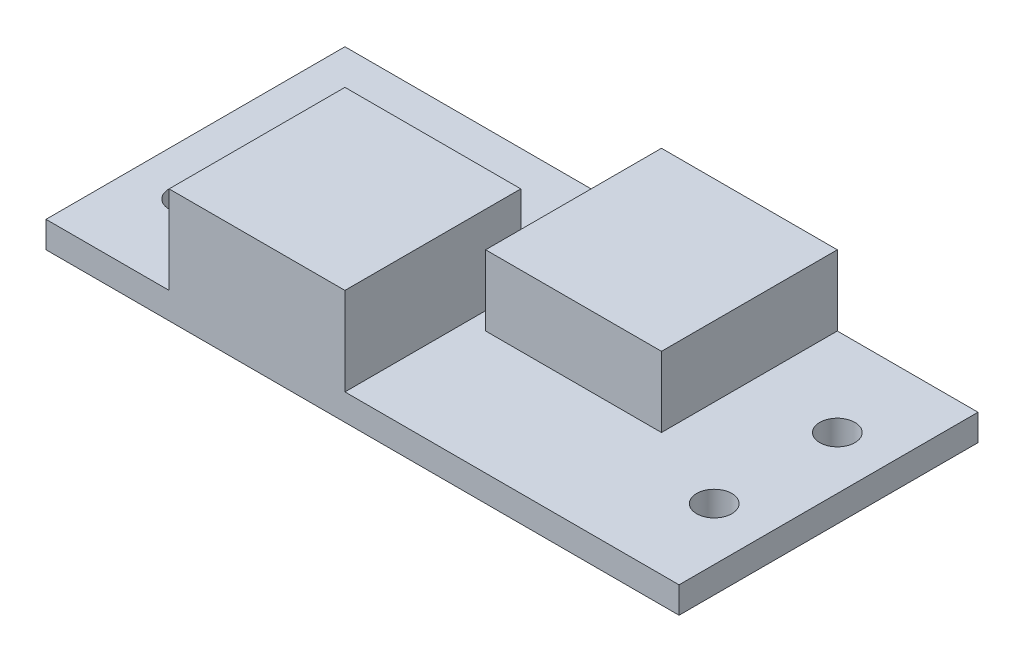
ISO-10303-21;
HEADER;
FILE_DESCRIPTION(('STEP AP214'),'2;1');
FILE_NAME('part.step','',(''),(''),'','','');
FILE_SCHEMA(('AUTOMOTIVE_DESIGN { 1 0 10303 214 1 1 1 1 }'));
ENDSEC;
DATA;
#1=APPLICATION_CONTEXT('core data for automotive mechanical design processes');
#2=APPLICATION_PROTOCOL_DEFINITION('international standard','automotive_design',2000,#1);
#3=PRODUCT_CONTEXT('',#1,'mechanical');
#4=PRODUCT('Part','Part','',(#3));
#5=PRODUCT_RELATED_PRODUCT_CATEGORY('part','',(#4));
#6=PRODUCT_DEFINITION_FORMATION('','',#4);
#7=PRODUCT_DEFINITION_CONTEXT('part definition',#1,'design');
#8=PRODUCT_DEFINITION('design','',#6,#7);
#9=PRODUCT_DEFINITION_SHAPE('','',#8);
#10=(LENGTH_UNIT() NAMED_UNIT(*) SI_UNIT(.MILLI.,.METRE.));
#11=(NAMED_UNIT(*) PLANE_ANGLE_UNIT() SI_UNIT($,.RADIAN.));
#12=(NAMED_UNIT(*) SI_UNIT($,.STERADIAN.) SOLID_ANGLE_UNIT());
#13=UNCERTAINTY_MEASURE_WITH_UNIT(LENGTH_MEASURE(1.E-05),#10,'distance_accuracy_value','');
#14=(GEOMETRIC_REPRESENTATION_CONTEXT(3) GLOBAL_UNCERTAINTY_ASSIGNED_CONTEXT((#13)) GLOBAL_UNIT_ASSIGNED_CONTEXT((#10,
#11,#12)) REPRESENTATION_CONTEXT('',''));
#15=CARTESIAN_POINT('',(0.,0.,0.));
#16=DIRECTION('',(0.,0.,1.));
#17=DIRECTION('',(1.,0.,0.));
#18=AXIS2_PLACEMENT_3D('',#15,#16,#17);
#19=CARTESIAN_POINT('',(0.,1.5,0.));
#20=DIRECTION('',(0.,1.,0.));
#21=DIRECTION('',(0.,0.,1.));
#22=AXIS2_PLACEMENT_3D('',#19,#20,#21);
#23=PLANE('',#22);
#24=CARTESIAN_POINT('',(33.,1.5,5.));
#25=DIRECTION('',(0.,1.,0.));
#26=DIRECTION('',(0.,0.,1.));
#27=AXIS2_PLACEMENT_3D('',#24,#25,#26);
#28=CIRCLE('',#27,1.);
#29=CARTESIAN_POINT('',(33.,1.5,6.));
#30=VERTEX_POINT('',#29);
#31=EDGE_CURVE('E253',#30,#30,#28,.T.);
#32=ORIENTED_EDGE('',*,*,#31,.F.);
#33=EDGE_LOOP('',(#32));
#34=FACE_BOUND('',#33,.T.);
#35=CARTESIAN_POINT('',(33.,1.5,12.));
#36=DIRECTION('',(0.,1.,0.));
#37=DIRECTION('',(0.,0.,1.));
#38=AXIS2_PLACEMENT_3D('',#35,#36,#37);
#39=CIRCLE('',#38,1.);
#40=CARTESIAN_POINT('',(33.,1.5,13.));
#41=VERTEX_POINT('',#40);
#42=EDGE_CURVE('E260',#41,#41,#39,.T.);
#43=ORIENTED_EDGE('',*,*,#42,.F.);
#44=EDGE_LOOP('',(#43));
#45=FACE_BOUND('',#44,.T.);
#46=CARTESIAN_POINT('',(3.,1.5,12.));
#47=DIRECTION('',(0.,1.,0.));
#48=DIRECTION('',(0.,0.,1.));
#49=AXIS2_PLACEMENT_3D('',#46,#47,#48);
#50=CIRCLE('',#49,1.);
#51=CARTESIAN_POINT('',(3.,1.5,13.));
#52=VERTEX_POINT('',#51);
#53=EDGE_CURVE('E249',#52,#52,#50,.T.);
#54=ORIENTED_EDGE('',*,*,#53,.F.);
#55=EDGE_LOOP('',(#54));
#56=FACE_BOUND('',#55,.T.);
#57=CARTESIAN_POINT('',(3.,1.5,5.));
#58=DIRECTION('',(0.,1.,0.));
#59=DIRECTION('',(0.,0.,1.));
#60=AXIS2_PLACEMENT_3D('',#57,#58,#59);
#61=CIRCLE('',#60,1.);
#62=CARTESIAN_POINT('',(3.,1.5,6.));
#63=VERTEX_POINT('',#62);
#64=EDGE_CURVE('E245',#63,#63,#61,.T.);
#65=ORIENTED_EDGE('',*,*,#64,.F.);
#66=EDGE_LOOP('',(#65));
#67=FACE_BOUND('',#66,.T.);
#68=DIRECTION('',(1.,0.,0.));
#69=VECTOR('',#68,1.);
#70=CARTESIAN_POINT('',(0.,1.5,17.));
#71=LINE('',#70,#69);
#72=CARTESIAN_POINT('',(0.,1.5,17.));
#73=VERTEX_POINT('',#72);
#74=CARTESIAN_POINT('',(7.,1.5,17.));
#75=VERTEX_POINT('',#74);
#76=EDGE_CURVE('E209',#73,#75,#71,.T.);
#77=ORIENTED_EDGE('',*,*,#76,.T.);
#78=DIRECTION('',(0.,0.,1.));
#79=VECTOR('',#78,1.);
#80=CARTESIAN_POINT('',(7.,1.5,17.));
#81=LINE('',#80,#79);
#82=CARTESIAN_POINT('',(7.,1.5,7.));
#83=VERTEX_POINT('',#82);
#84=EDGE_CURVE('E156',#83,#75,#81,.T.);
#85=ORIENTED_EDGE('',*,*,#84,.F.);
#86=DIRECTION('',(-1.,0.,0.));
#87=VECTOR('',#86,1.);
#88=CARTESIAN_POINT('',(7.,1.5,7.));
#89=LINE('',#88,#87);
#90=CARTESIAN_POINT('',(17.,1.5,7.));
#91=VERTEX_POINT('',#90);
#92=EDGE_CURVE('E152',#91,#83,#89,.T.);
#93=ORIENTED_EDGE('',*,*,#92,.F.);
#94=DIRECTION('',(0.,0.,-1.));
#95=VECTOR('',#94,1.);
#96=CARTESIAN_POINT('',(17.,1.5,17.));
#97=LINE('',#96,#95);
#98=CARTESIAN_POINT('',(17.,1.5,17.));
#99=VERTEX_POINT('',#98);
#100=EDGE_CURVE('E281',#99,#91,#97,.T.);
#101=ORIENTED_EDGE('',*,*,#100,.F.);
#102=CARTESIAN_POINT('',(36.,1.5,17.));
#103=VERTEX_POINT('',#102);
#104=EDGE_CURVE('E207',#99,#103,#71,.T.);
#105=ORIENTED_EDGE('',*,*,#104,.T.);
#106=DIRECTION('',(0.,0.,-1.));
#107=VECTOR('',#106,1.);
#108=CARTESIAN_POINT('',(36.,1.5,0.));
#109=LINE('',#108,#107);
#110=CARTESIAN_POINT('',(36.,1.5,0.));
#111=VERTEX_POINT('',#110);
#112=EDGE_CURVE('E212',#103,#111,#109,.T.);
#113=ORIENTED_EDGE('',*,*,#112,.T.);
#114=DIRECTION('',(-1.,0.,0.));
#115=VECTOR('',#114,1.);
#116=CARTESIAN_POINT('',(0.,1.5,0.));
#117=LINE('',#116,#115);
#118=CARTESIAN_POINT('',(28.,1.5,0.));
#119=VERTEX_POINT('',#118);
#120=EDGE_CURVE('E216',#111,#119,#117,.T.);
#121=ORIENTED_EDGE('',*,*,#120,.T.);
#122=DIRECTION('',(0.,0.,-1.));
#123=VECTOR('',#122,1.);
#124=CARTESIAN_POINT('',(28.,1.5,0.));
#125=LINE('',#124,#123);
#126=CARTESIAN_POINT('',(28.,1.5,10.));
#127=VERTEX_POINT('',#126);
#128=EDGE_CURVE('E65',#127,#119,#125,.T.);
#129=ORIENTED_EDGE('',*,*,#128,.F.);
#130=DIRECTION('',(1.,0.,0.));
#131=VECTOR('',#130,1.);
#132=CARTESIAN_POINT('',(28.,1.5,10.));
#133=LINE('',#132,#131);
#134=CARTESIAN_POINT('',(18.,1.5,10.));
#135=VERTEX_POINT('',#134);
#136=EDGE_CURVE('E172',#135,#127,#133,.T.);
#137=ORIENTED_EDGE('',*,*,#136,.F.);
#138=DIRECTION('',(0.,0.,1.));
#139=VECTOR('',#138,1.);
#140=CARTESIAN_POINT('',(18.,1.5,0.));
#141=LINE('',#140,#139);
#142=CARTESIAN_POINT('',(18.,1.5,0.));
#143=VERTEX_POINT('',#142);
#144=EDGE_CURVE('E162',#143,#135,#141,.T.);
#145=ORIENTED_EDGE('',*,*,#144,.F.);
#146=CARTESIAN_POINT('',(0.,1.5,0.));
#147=VERTEX_POINT('',#146);
#148=EDGE_CURVE('E215',#143,#147,#117,.T.);
#149=ORIENTED_EDGE('',*,*,#148,.T.);
#150=DIRECTION('',(0.,0.,1.));
#151=VECTOR('',#150,1.);
#152=CARTESIAN_POINT('',(0.,1.5,0.));
#153=LINE('',#152,#151);
#154=EDGE_CURVE('E203',#147,#73,#153,.T.);
#155=ORIENTED_EDGE('',*,*,#154,.T.);
#156=EDGE_LOOP('',(#77,#85,#93,#101,#105,#113,#121,#129,#137,#145,#149,#155));
#157=FACE_BOUND('',#156,.T.);
#158=ADVANCED_FACE('F39',(#34,#45,#56,#67,#157),#23,.T.);
#159=CARTESIAN_POINT('',(0.,1.5,0.));
#160=DIRECTION('',(1.,0.,0.));
#161=DIRECTION('',(0.,0.,-1.));
#162=AXIS2_PLACEMENT_3D('',#159,#160,#161);
#163=PLANE('',#162);
#164=DIRECTION('',(0.,0.,1.));
#165=VECTOR('',#164,1.);
#166=CARTESIAN_POINT('',(0.,0.,0.));
#167=LINE('',#166,#165);
#168=CARTESIAN_POINT('',(0.,0.,0.));
#169=VERTEX_POINT('',#168);
#170=CARTESIAN_POINT('',(0.,0.,17.));
#171=VERTEX_POINT('',#170);
#172=EDGE_CURVE('E202',#169,#171,#167,.T.);
#173=ORIENTED_EDGE('',*,*,#172,.T.);
#174=DIRECTION('',(0.,-1.,0.));
#175=VECTOR('',#174,1.);
#176=CARTESIAN_POINT('',(0.,1.5,17.));
#177=LINE('',#176,#175);
#178=EDGE_CURVE('E11',#73,#171,#177,.T.);
#179=ORIENTED_EDGE('',*,*,#178,.F.);
#180=ORIENTED_EDGE('',*,*,#154,.F.);
#181=DIRECTION('',(0.,-1.,0.));
#182=VECTOR('',#181,1.);
#183=CARTESIAN_POINT('',(0.,1.5,0.));
#184=LINE('',#183,#182);
#185=EDGE_CURVE('E219',#147,#169,#184,.T.);
#186=ORIENTED_EDGE('',*,*,#185,.T.);
#187=EDGE_LOOP('',(#173,#179,#180,#186));
#188=FACE_BOUND('',#187,.T.);
#189=ADVANCED_FACE('F41',(#188),#163,.F.);
#190=CARTESIAN_POINT('',(0.,1.5,17.));
#191=DIRECTION('',(0.,0.,-1.));
#192=DIRECTION('',(-1.,0.,0.));
#193=AXIS2_PLACEMENT_3D('',#190,#191,#192);
#194=PLANE('',#193);
#195=DIRECTION('',(1.,0.,0.));
#196=VECTOR('',#195,1.);
#197=CARTESIAN_POINT('',(0.,0.,17.));
#198=LINE('',#197,#196);
#199=CARTESIAN_POINT('',(36.,0.,17.));
#200=VERTEX_POINT('',#199);
#201=EDGE_CURVE('E223',#171,#200,#198,.T.);
#202=ORIENTED_EDGE('',*,*,#201,.T.);
#203=DIRECTION('',(0.,-1.,0.));
#204=VECTOR('',#203,1.);
#205=CARTESIAN_POINT('',(36.,1.5,17.));
#206=LINE('',#205,#204);
#207=EDGE_CURVE('E49',#103,#200,#206,.T.);
#208=ORIENTED_EDGE('',*,*,#207,.F.);
#209=ORIENTED_EDGE('',*,*,#104,.F.);
#210=DIRECTION('',(0.,-1.,0.));
#211=VECTOR('',#210,1.);
#212=CARTESIAN_POINT('',(17.,6.5,17.));
#213=LINE('',#212,#211);
#214=CARTESIAN_POINT('',(17.,6.5,17.));
#215=VERTEX_POINT('',#214);
#216=EDGE_CURVE('E138',#215,#99,#213,.T.);
#217=ORIENTED_EDGE('',*,*,#216,.F.);
#218=DIRECTION('',(1.,0.,0.));
#219=VECTOR('',#218,1.);
#220=CARTESIAN_POINT('',(7.,6.5,17.));
#221=LINE('',#220,#219);
#222=CARTESIAN_POINT('',(7.,6.5,17.));
#223=VERTEX_POINT('',#222);
#224=EDGE_CURVE('E131',#223,#215,#221,.T.);
#225=ORIENTED_EDGE('',*,*,#224,.F.);
#226=DIRECTION('',(0.,-1.,0.));
#227=VECTOR('',#226,1.);
#228=CARTESIAN_POINT('',(7.,6.5,17.));
#229=LINE('',#228,#227);
#230=EDGE_CURVE('E135',#223,#75,#229,.T.);
#231=ORIENTED_EDGE('',*,*,#230,.T.);
#232=ORIENTED_EDGE('',*,*,#76,.F.);
#233=ORIENTED_EDGE('',*,*,#178,.T.);
#234=EDGE_LOOP('',(#202,#208,#209,#217,#225,#231,#232,#233));
#235=FACE_BOUND('',#234,.T.);
#236=ADVANCED_FACE('F133',(#235),#194,.F.);
#237=CARTESIAN_POINT('',(36.,1.5,0.));
#238=DIRECTION('',(-1.,0.,0.));
#239=DIRECTION('',(0.,0.,1.));
#240=AXIS2_PLACEMENT_3D('',#237,#238,#239);
#241=PLANE('',#240);
#242=DIRECTION('',(0.,0.,-1.));
#243=VECTOR('',#242,1.);
#244=CARTESIAN_POINT('',(36.,0.,0.));
#245=LINE('',#244,#243);
#246=CARTESIAN_POINT('',(36.,0.,0.));
#247=VERTEX_POINT('',#246);
#248=EDGE_CURVE('E226',#200,#247,#245,.T.);
#249=ORIENTED_EDGE('',*,*,#248,.T.);
#250=DIRECTION('',(0.,-1.,0.));
#251=VECTOR('',#250,1.);
#252=CARTESIAN_POINT('',(36.,1.5,0.));
#253=LINE('',#252,#251);
#254=EDGE_CURVE('E234',#111,#247,#253,.T.);
#255=ORIENTED_EDGE('',*,*,#254,.F.);
#256=ORIENTED_EDGE('',*,*,#112,.F.);
#257=ORIENTED_EDGE('',*,*,#207,.T.);
#258=EDGE_LOOP('',(#249,#255,#256,#257));
#259=FACE_BOUND('',#258,.T.);
#260=ADVANCED_FACE('F302',(#259),#241,.F.);
#261=CARTESIAN_POINT('',(0.,1.5,0.));
#262=DIRECTION('',(0.,0.,1.));
#263=DIRECTION('',(1.,0.,0.));
#264=AXIS2_PLACEMENT_3D('',#261,#262,#263);
#265=PLANE('',#264);
#266=DIRECTION('',(-1.,0.,0.));
#267=VECTOR('',#266,1.);
#268=CARTESIAN_POINT('',(0.,0.,0.));
#269=LINE('',#268,#267);
#270=EDGE_CURVE('E208',#247,#169,#269,.T.);
#271=ORIENTED_EDGE('',*,*,#270,.T.);
#272=ORIENTED_EDGE('',*,*,#185,.F.);
#273=ORIENTED_EDGE('',*,*,#148,.F.);
#274=DIRECTION('',(0.,-1.,0.));
#275=VECTOR('',#274,1.);
#276=CARTESIAN_POINT('',(18.,5.5,0.));
#277=LINE('',#276,#275);
#278=CARTESIAN_POINT('',(18.,5.5,0.));
#279=VERTEX_POINT('',#278);
#280=EDGE_CURVE('E194',#279,#143,#277,.T.);
#281=ORIENTED_EDGE('',*,*,#280,.F.);
#282=DIRECTION('',(-1.,0.,0.));
#283=VECTOR('',#282,1.);
#284=CARTESIAN_POINT('',(28.,5.5,0.));
#285=LINE('',#284,#283);
#286=CARTESIAN_POINT('',(28.,5.5,0.));
#287=VERTEX_POINT('',#286);
#288=EDGE_CURVE('E171',#287,#279,#285,.T.);
#289=ORIENTED_EDGE('',*,*,#288,.F.);
#290=DIRECTION('',(0.,-1.,0.));
#291=VECTOR('',#290,1.);
#292=CARTESIAN_POINT('',(28.,5.5,0.));
#293=LINE('',#292,#291);
#294=EDGE_CURVE('E198',#287,#119,#293,.T.);
#295=ORIENTED_EDGE('',*,*,#294,.T.);
#296=ORIENTED_EDGE('',*,*,#120,.F.);
#297=ORIENTED_EDGE('',*,*,#254,.T.);
#298=EDGE_LOOP('',(#271,#272,#273,#281,#289,#295,#296,#297));
#299=FACE_BOUND('',#298,.T.);
#300=ADVANCED_FACE('F306',(#299),#265,.F.);
#301=CARTESIAN_POINT('',(0.,0.,0.));
#302=DIRECTION('',(0.,1.,0.));
#303=DIRECTION('',(0.,0.,1.));
#304=AXIS2_PLACEMENT_3D('',#301,#302,#303);
#305=PLANE('',#304);
#306=CARTESIAN_POINT('',(33.,0.,5.));
#307=DIRECTION('',(0.,1.,0.));
#308=DIRECTION('',(0.,0.,1.));
#309=AXIS2_PLACEMENT_3D('',#306,#307,#308);
#310=CIRCLE('',#309,1.);
#311=CARTESIAN_POINT('',(33.,0.,6.));
#312=VERTEX_POINT('',#311);
#313=EDGE_CURVE('E43',#312,#312,#310,.T.);
#314=ORIENTED_EDGE('',*,*,#313,.T.);
#315=EDGE_LOOP('',(#314));
#316=FACE_BOUND('',#315,.T.);
#317=CARTESIAN_POINT('',(33.,0.,12.));
#318=DIRECTION('',(0.,1.,0.));
#319=DIRECTION('',(0.,0.,1.));
#320=AXIS2_PLACEMENT_3D('',#317,#318,#319);
#321=CIRCLE('',#320,1.);
#322=CARTESIAN_POINT('',(33.,0.,13.));
#323=VERTEX_POINT('',#322);
#324=EDGE_CURVE('E250',#323,#323,#321,.T.);
#325=ORIENTED_EDGE('',*,*,#324,.T.);
#326=EDGE_LOOP('',(#325));
#327=FACE_BOUND('',#326,.T.);
#328=CARTESIAN_POINT('',(3.,0.,12.));
#329=DIRECTION('',(0.,1.,0.));
#330=DIRECTION('',(0.,0.,1.));
#331=AXIS2_PLACEMENT_3D('',#328,#329,#330);
#332=CIRCLE('',#331,1.);
#333=CARTESIAN_POINT('',(3.,0.,13.));
#334=VERTEX_POINT('',#333);
#335=EDGE_CURVE('E246',#334,#334,#332,.T.);
#336=ORIENTED_EDGE('',*,*,#335,.T.);
#337=EDGE_LOOP('',(#336));
#338=FACE_BOUND('',#337,.T.);
#339=CARTESIAN_POINT('',(3.,0.,5.));
#340=DIRECTION('',(0.,1.,0.));
#341=DIRECTION('',(0.,0.,1.));
#342=AXIS2_PLACEMENT_3D('',#339,#340,#341);
#343=CIRCLE('',#342,1.);
#344=CARTESIAN_POINT('',(3.,0.,6.));
#345=VERTEX_POINT('',#344);
#346=EDGE_CURVE('E241',#345,#345,#343,.T.);
#347=ORIENTED_EDGE('',*,*,#346,.T.);
#348=EDGE_LOOP('',(#347));
#349=FACE_BOUND('',#348,.T.);
#350=ORIENTED_EDGE('',*,*,#172,.F.);
#351=ORIENTED_EDGE('',*,*,#270,.F.);
#352=ORIENTED_EDGE('',*,*,#248,.F.);
#353=ORIENTED_EDGE('',*,*,#201,.F.);
#354=EDGE_LOOP('',(#350,#351,#352,#353));
#355=FACE_BOUND('',#354,.T.);
#356=ADVANCED_FACE('F298',(#316,#327,#338,#349,#355),#305,.F.);
#357=CARTESIAN_POINT('',(28.,5.5,0.));
#358=DIRECTION('',(-1.,0.,0.));
#359=DIRECTION('',(0.,0.,1.));
#360=AXIS2_PLACEMENT_3D('',#357,#358,#359);
#361=PLANE('',#360);
#362=ORIENTED_EDGE('',*,*,#128,.T.);
#363=ORIENTED_EDGE('',*,*,#294,.F.);
#364=DIRECTION('',(0.,0.,-1.));
#365=VECTOR('',#364,1.);
#366=CARTESIAN_POINT('',(28.,5.5,0.));
#367=LINE('',#366,#365);
#368=CARTESIAN_POINT('',(28.,5.5,10.));
#369=VERTEX_POINT('',#368);
#370=EDGE_CURVE('E167',#369,#287,#367,.T.);
#371=ORIENTED_EDGE('',*,*,#370,.F.);
#372=DIRECTION('',(0.,-1.,0.));
#373=VECTOR('',#372,1.);
#374=CARTESIAN_POINT('',(28.,5.5,10.));
#375=LINE('',#374,#373);
#376=EDGE_CURVE('E180',#369,#127,#375,.T.);
#377=ORIENTED_EDGE('',*,*,#376,.T.);
#378=EDGE_LOOP('',(#362,#363,#371,#377));
#379=FACE_BOUND('',#378,.T.);
#380=ADVANCED_FACE('F322',(#379),#361,.F.);
#381=CARTESIAN_POINT('',(18.,5.5,0.));
#382=DIRECTION('',(1.,0.,0.));
#383=DIRECTION('',(0.,0.,-1.));
#384=AXIS2_PLACEMENT_3D('',#381,#382,#383);
#385=PLANE('',#384);
#386=ORIENTED_EDGE('',*,*,#144,.T.);
#387=DIRECTION('',(0.,-1.,0.));
#388=VECTOR('',#387,1.);
#389=CARTESIAN_POINT('',(18.,5.5,10.));
#390=LINE('',#389,#388);
#391=CARTESIAN_POINT('',(18.,5.5,10.));
#392=VERTEX_POINT('',#391);
#393=EDGE_CURVE('E190',#392,#135,#390,.T.);
#394=ORIENTED_EDGE('',*,*,#393,.F.);
#395=DIRECTION('',(0.,0.,1.));
#396=VECTOR('',#395,1.);
#397=CARTESIAN_POINT('',(18.,5.5,0.));
#398=LINE('',#397,#396);
#399=EDGE_CURVE('E175',#279,#392,#398,.T.);
#400=ORIENTED_EDGE('',*,*,#399,.F.);
#401=ORIENTED_EDGE('',*,*,#280,.T.);
#402=EDGE_LOOP('',(#386,#394,#400,#401));
#403=FACE_BOUND('',#402,.T.);
#404=ADVANCED_FACE('F314',(#403),#385,.F.);
#405=CARTESIAN_POINT('',(28.,5.5,10.));
#406=DIRECTION('',(0.,0.,-1.));
#407=DIRECTION('',(-1.,0.,0.));
#408=AXIS2_PLACEMENT_3D('',#405,#406,#407);
#409=PLANE('',#408);
#410=ORIENTED_EDGE('',*,*,#136,.T.);
#411=ORIENTED_EDGE('',*,*,#376,.F.);
#412=DIRECTION('',(1.,0.,0.));
#413=VECTOR('',#412,1.);
#414=CARTESIAN_POINT('',(28.,5.5,10.));
#415=LINE('',#414,#413);
#416=EDGE_CURVE('E178',#392,#369,#415,.T.);
#417=ORIENTED_EDGE('',*,*,#416,.F.);
#418=ORIENTED_EDGE('',*,*,#393,.T.);
#419=EDGE_LOOP('',(#410,#411,#417,#418));
#420=FACE_BOUND('',#419,.T.);
#421=ADVANCED_FACE('F324',(#420),#409,.F.);
#422=CARTESIAN_POINT('',(0.,5.5,0.));
#423=DIRECTION('',(0.,-1.,0.));
#424=DIRECTION('',(0.,0.,-1.));
#425=AXIS2_PLACEMENT_3D('',#422,#423,#424);
#426=PLANE('',#425);
#427=ORIENTED_EDGE('',*,*,#370,.T.);
#428=ORIENTED_EDGE('',*,*,#288,.T.);
#429=ORIENTED_EDGE('',*,*,#399,.T.);
#430=ORIENTED_EDGE('',*,*,#416,.T.);
#431=EDGE_LOOP('',(#427,#428,#429,#430));
#432=FACE_BOUND('',#431,.T.);
#433=ADVANCED_FACE('F318',(#432),#426,.F.);
#434=CARTESIAN_POINT('',(7.,6.5,17.));
#435=DIRECTION('',(1.,0.,0.));
#436=DIRECTION('',(0.,0.,-1.));
#437=AXIS2_PLACEMENT_3D('',#434,#435,#436);
#438=PLANE('',#437);
#439=ORIENTED_EDGE('',*,*,#84,.T.);
#440=ORIENTED_EDGE('',*,*,#230,.F.);
#441=DIRECTION('',(0.,0.,1.));
#442=VECTOR('',#441,1.);
#443=CARTESIAN_POINT('',(7.,6.5,17.));
#444=LINE('',#443,#442);
#445=CARTESIAN_POINT('',(7.,6.5,7.));
#446=VERTEX_POINT('',#445);
#447=EDGE_CURVE('E143',#446,#223,#444,.T.);
#448=ORIENTED_EDGE('',*,*,#447,.F.);
#449=DIRECTION('',(0.,-1.,0.));
#450=VECTOR('',#449,1.);
#451=CARTESIAN_POINT('',(7.,6.5,7.));
#452=LINE('',#451,#450);
#453=EDGE_CURVE('E278',#446,#83,#452,.T.);
#454=ORIENTED_EDGE('',*,*,#453,.T.);
#455=EDGE_LOOP('',(#439,#440,#448,#454));
#456=FACE_BOUND('',#455,.T.);
#457=ADVANCED_FACE('F154',(#456),#438,.F.);
#458=CARTESIAN_POINT('',(17.,6.5,17.));
#459=DIRECTION('',(-1.,0.,0.));
#460=DIRECTION('',(0.,0.,1.));
#461=AXIS2_PLACEMENT_3D('',#458,#459,#460);
#462=PLANE('',#461);
#463=ORIENTED_EDGE('',*,*,#100,.T.);
#464=DIRECTION('',(0.,-1.,0.));
#465=VECTOR('',#464,1.);
#466=CARTESIAN_POINT('',(17.,6.5,7.));
#467=LINE('',#466,#465);
#468=CARTESIAN_POINT('',(17.,6.5,7.));
#469=VERTEX_POINT('',#468);
#470=EDGE_CURVE('E57',#469,#91,#467,.T.);
#471=ORIENTED_EDGE('',*,*,#470,.F.);
#472=DIRECTION('',(0.,0.,-1.));
#473=VECTOR('',#472,1.);
#474=CARTESIAN_POINT('',(17.,6.5,17.));
#475=LINE('',#474,#473);
#476=EDGE_CURVE('E142',#215,#469,#475,.T.);
#477=ORIENTED_EDGE('',*,*,#476,.F.);
#478=ORIENTED_EDGE('',*,*,#216,.T.);
#479=EDGE_LOOP('',(#463,#471,#477,#478));
#480=FACE_BOUND('',#479,.T.);
#481=ADVANCED_FACE('F394',(#480),#462,.F.);
#482=CARTESIAN_POINT('',(7.,6.5,7.));
#483=DIRECTION('',(0.,0.,1.));
#484=DIRECTION('',(1.,0.,0.));
#485=AXIS2_PLACEMENT_3D('',#482,#483,#484);
#486=PLANE('',#485);
#487=ORIENTED_EDGE('',*,*,#92,.T.);
#488=ORIENTED_EDGE('',*,*,#453,.F.);
#489=DIRECTION('',(-1.,0.,0.));
#490=VECTOR('',#489,1.);
#491=CARTESIAN_POINT('',(7.,6.5,7.));
#492=LINE('',#491,#490);
#493=EDGE_CURVE('E147',#469,#446,#492,.T.);
#494=ORIENTED_EDGE('',*,*,#493,.F.);
#495=ORIENTED_EDGE('',*,*,#470,.T.);
#496=EDGE_LOOP('',(#487,#488,#494,#495));
#497=FACE_BOUND('',#496,.T.);
#498=ADVANCED_FACE('F401',(#497),#486,.F.);
#499=CARTESIAN_POINT('',(0.,6.5,0.));
#500=DIRECTION('',(0.,-1.,0.));
#501=DIRECTION('',(0.,0.,-1.));
#502=AXIS2_PLACEMENT_3D('',#499,#500,#501);
#503=PLANE('',#502);
#504=ORIENTED_EDGE('',*,*,#447,.T.);
#505=ORIENTED_EDGE('',*,*,#224,.T.);
#506=ORIENTED_EDGE('',*,*,#476,.T.);
#507=ORIENTED_EDGE('',*,*,#493,.T.);
#508=EDGE_LOOP('',(#504,#505,#506,#507));
#509=FACE_BOUND('',#508,.T.);
#510=ADVANCED_FACE('F146',(#509),#503,.F.);
#511=CARTESIAN_POINT('',(3.,-3.5,5.));
#512=DIRECTION('',(0.,1.,0.));
#513=DIRECTION('',(0.,0.,1.));
#514=AXIS2_PLACEMENT_3D('',#511,#512,#513);
#515=CYLINDRICAL_SURFACE('',#514,1.);
#516=ORIENTED_EDGE('',*,*,#64,.T.);
#517=EDGE_LOOP('',(#516));
#518=FACE_BOUND('',#517,.T.);
#519=ORIENTED_EDGE('',*,*,#346,.F.);
#520=EDGE_LOOP('',(#519));
#521=FACE_BOUND('',#520,.T.);
#522=ADVANCED_FACE('F415',(#518,#521),#515,.F.);
#523=CARTESIAN_POINT('',(3.,-3.5,12.));
#524=DIRECTION('',(0.,1.,0.));
#525=DIRECTION('',(0.,0.,1.));
#526=AXIS2_PLACEMENT_3D('',#523,#524,#525);
#527=CYLINDRICAL_SURFACE('',#526,1.);
#528=ORIENTED_EDGE('',*,*,#53,.T.);
#529=EDGE_LOOP('',(#528));
#530=FACE_BOUND('',#529,.T.);
#531=ORIENTED_EDGE('',*,*,#335,.F.);
#532=EDGE_LOOP('',(#531));
#533=FACE_BOUND('',#532,.T.);
#534=ADVANCED_FACE('F422',(#530,#533),#527,.F.);
#535=CARTESIAN_POINT('',(33.,-3.5,12.));
#536=DIRECTION('',(0.,1.,0.));
#537=DIRECTION('',(0.,0.,1.));
#538=AXIS2_PLACEMENT_3D('',#535,#536,#537);
#539=CYLINDRICAL_SURFACE('',#538,1.);
#540=ORIENTED_EDGE('',*,*,#42,.T.);
#541=EDGE_LOOP('',(#540));
#542=FACE_BOUND('',#541,.T.);
#543=ORIENTED_EDGE('',*,*,#324,.F.);
#544=EDGE_LOOP('',(#543));
#545=FACE_BOUND('',#544,.T.);
#546=ADVANCED_FACE('F430',(#542,#545),#539,.F.);
#547=CARTESIAN_POINT('',(33.,-3.5,5.));
#548=DIRECTION('',(0.,1.,0.));
#549=DIRECTION('',(0.,0.,1.));
#550=AXIS2_PLACEMENT_3D('',#547,#548,#549);
#551=CYLINDRICAL_SURFACE('',#550,1.);
#552=ORIENTED_EDGE('',*,*,#31,.T.);
#553=EDGE_LOOP('',(#552));
#554=FACE_BOUND('',#553,.T.);
#555=ORIENTED_EDGE('',*,*,#313,.F.);
#556=EDGE_LOOP('',(#555));
#557=FACE_BOUND('',#556,.T.);
#558=ADVANCED_FACE('F437',(#554,#557),#551,.F.);
#559=CLOSED_SHELL('',(#158,#189,#236,#260,#300,#356,#380,#404,#421,#433,#457,#481,#498,#510,
#522,#534,#546,#558));
#560=MANIFOLD_SOLID_BREP('B2',#559);
#561=ADVANCED_BREP_SHAPE_REPRESENTATION('',(#18,#560),#14);
#562=SHAPE_DEFINITION_REPRESENTATION(#9,#561);
ENDSEC;
END-ISO-10303-21;
